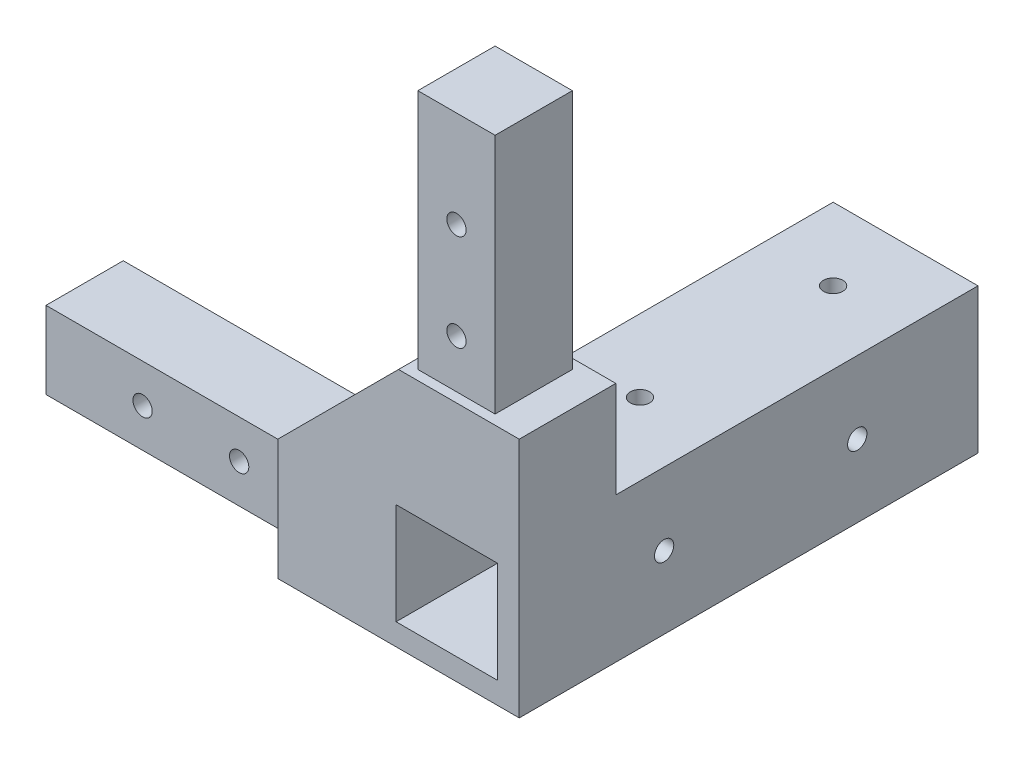
ISO-10303-21;
HEADER;
FILE_DESCRIPTION(('STEP AP214'),'2;1');
FILE_NAME('part.step','',(''),(''),'','','');
FILE_SCHEMA(('AUTOMOTIVE_DESIGN { 1 0 10303 214 1 1 1 1 }'));
ENDSEC;
DATA;
#1=APPLICATION_CONTEXT('core data for automotive mechanical design processes');
#2=APPLICATION_PROTOCOL_DEFINITION('international standard','automotive_design',2000,#1);
#3=PRODUCT_CONTEXT('',#1,'mechanical');
#4=PRODUCT('Part','Part','',(#3));
#5=PRODUCT_RELATED_PRODUCT_CATEGORY('part','',(#4));
#6=PRODUCT_DEFINITION_FORMATION('','',#4);
#7=PRODUCT_DEFINITION_CONTEXT('part definition',#1,'design');
#8=PRODUCT_DEFINITION('design','',#6,#7);
#9=PRODUCT_DEFINITION_SHAPE('','',#8);
#10=(LENGTH_UNIT() NAMED_UNIT(*) SI_UNIT(.MILLI.,.METRE.));
#11=(NAMED_UNIT(*) PLANE_ANGLE_UNIT() SI_UNIT($,.RADIAN.));
#12=(NAMED_UNIT(*) SI_UNIT($,.STERADIAN.) SOLID_ANGLE_UNIT());
#13=UNCERTAINTY_MEASURE_WITH_UNIT(LENGTH_MEASURE(1.E-05),#10,'distance_accuracy_value','');
#14=(GEOMETRIC_REPRESENTATION_CONTEXT(3) GLOBAL_UNCERTAINTY_ASSIGNED_CONTEXT((#13)) GLOBAL_UNIT_ASSIGNED_CONTEXT((#10,
#11,#12)) REPRESENTATION_CONTEXT('',''));
#15=CARTESIAN_POINT('',(0.,0.,0.));
#16=DIRECTION('',(0.,0.,1.));
#17=DIRECTION('',(1.,0.,0.));
#18=AXIS2_PLACEMENT_3D('',#15,#16,#17);
#19=CARTESIAN_POINT('',(50.,-50.,-100.));
#20=DIRECTION('',(1.,0.,0.));
#21=DIRECTION('',(0.,0.,-1.));
#22=AXIS2_PLACEMENT_3D('',#19,#20,#21);
#23=PLANE('',#22);
#24=DIRECTION('',(0.,0.,-1.));
#25=VECTOR('',#24,1.);
#26=CARTESIAN_POINT('',(50.,-20.,-30.));
#27=LINE('',#26,#25);
#28=CARTESIAN_POINT('',(50.,-20.,-25.));
#29=VERTEX_POINT('',#28);
#30=CARTESIAN_POINT('',(50.,-20.,-100.));
#31=VERTEX_POINT('',#30);
#32=EDGE_CURVE('E388',#29,#31,#27,.T.);
#33=ORIENTED_EDGE('',*,*,#32,.F.);
#34=DIRECTION('',(0.,1.,0.));
#35=VECTOR('',#34,1.);
#36=CARTESIAN_POINT('',(50.,-24.,-25.));
#37=LINE('',#36,#35);
#38=CARTESIAN_POINT('',(50.,0.,-25.));
#39=VERTEX_POINT('',#38);
#40=EDGE_CURVE('E198',#29,#39,#37,.T.);
#41=ORIENTED_EDGE('',*,*,#40,.T.);
#42=DIRECTION('',(0.,0.,-1.));
#43=VECTOR('',#42,1.);
#44=CARTESIAN_POINT('',(50.,0.,-5.));
#45=LINE('',#44,#43);
#46=CARTESIAN_POINT('',(50.,0.,-5.));
#47=VERTEX_POINT('',#46);
#48=EDGE_CURVE('E189',#47,#39,#45,.T.);
#49=ORIENTED_EDGE('',*,*,#48,.F.);
#50=DIRECTION('',(0.,1.,0.));
#51=VECTOR('',#50,1.);
#52=CARTESIAN_POINT('',(50.,-50.,-5.));
#53=LINE('',#52,#51);
#54=CARTESIAN_POINT('',(50.,-50.,-5.));
#55=VERTEX_POINT('',#54);
#56=EDGE_CURVE('E173',#55,#47,#53,.T.);
#57=ORIENTED_EDGE('',*,*,#56,.F.);
#58=DIRECTION('',(0.,0.,1.));
#59=VECTOR('',#58,1.);
#60=CARTESIAN_POINT('',(50.,-50.,-100.));
#61=LINE('',#60,#59);
#62=CARTESIAN_POINT('',(50.,-50.,-100.));
#63=VERTEX_POINT('',#62);
#64=EDGE_CURVE('E11',#63,#55,#61,.T.);
#65=ORIENTED_EDGE('',*,*,#64,.F.);
#66=DIRECTION('',(0.,1.,0.));
#67=VECTOR('',#66,1.);
#68=CARTESIAN_POINT('',(50.,-50.,-100.));
#69=LINE('',#68,#67);
#70=EDGE_CURVE('E42',#63,#31,#69,.T.);
#71=ORIENTED_EDGE('',*,*,#70,.T.);
#72=EDGE_LOOP('',(#33,#41,#49,#57,#65,#71));
#73=FACE_BOUND('',#72,.T.);
#74=CARTESIAN_POINT('',(50.,-35.,-35.));
#75=DIRECTION('',(1.,0.,0.));
#76=DIRECTION('',(0.,0.,-1.));
#77=AXIS2_PLACEMENT_3D('',#74,#75,#76);
#78=CIRCLE('',#77,2.);
#79=CARTESIAN_POINT('',(50.,-35.,-37.));
#80=VERTEX_POINT('',#79);
#81=EDGE_CURVE('E241',#80,#80,#78,.T.);
#82=ORIENTED_EDGE('',*,*,#81,.F.);
#83=EDGE_LOOP('',(#82));
#84=FACE_BOUND('',#83,.T.);
#85=CARTESIAN_POINT('',(50.,-35.,-75.));
#86=DIRECTION('',(1.,0.,0.));
#87=DIRECTION('',(0.,0.,-1.));
#88=AXIS2_PLACEMENT_3D('',#85,#86,#87);
#89=CIRCLE('',#88,2.);
#90=CARTESIAN_POINT('',(50.,-35.,-77.));
#91=VERTEX_POINT('',#90);
#92=EDGE_CURVE('E252',#91,#91,#89,.T.);
#93=ORIENTED_EDGE('',*,*,#92,.F.);
#94=EDGE_LOOP('',(#93));
#95=FACE_BOUND('',#94,.T.);
#96=ADVANCED_FACE('F33',(#73,#84,#95),#23,.T.);
#97=CARTESIAN_POINT('',(20.,-50.,-30.));
#98=DIRECTION('',(1.,0.,0.));
#99=DIRECTION('',(0.,0.,-1.));
#100=AXIS2_PLACEMENT_3D('',#97,#98,#99);
#101=PLANE('',#100);
#102=CARTESIAN_POINT('',(20.,-35.,-75.));
#103=DIRECTION('',(1.,0.,0.));
#104=DIRECTION('',(0.,0.,-1.));
#105=AXIS2_PLACEMENT_3D('',#102,#103,#104);
#106=CIRCLE('',#105,2.);
#107=CARTESIAN_POINT('',(20.,-35.,-77.));
#108=VERTEX_POINT('',#107);
#109=EDGE_CURVE('E253',#108,#108,#106,.T.);
#110=ORIENTED_EDGE('',*,*,#109,.T.);
#111=EDGE_LOOP('',(#110));
#112=FACE_BOUND('',#111,.T.);
#113=CARTESIAN_POINT('',(20.,-35.,-35.));
#114=DIRECTION('',(1.,0.,0.));
#115=DIRECTION('',(0.,0.,-1.));
#116=AXIS2_PLACEMENT_3D('',#113,#114,#115);
#117=CIRCLE('',#116,2.);
#118=CARTESIAN_POINT('',(20.,-35.,-37.));
#119=VERTEX_POINT('',#118);
#120=EDGE_CURVE('E244',#119,#119,#117,.T.);
#121=ORIENTED_EDGE('',*,*,#120,.T.);
#122=EDGE_LOOP('',(#121));
#123=FACE_BOUND('',#122,.T.);
#124=DIRECTION('',(0.,0.,-1.));
#125=VECTOR('',#124,1.);
#126=CARTESIAN_POINT('',(20.,-50.,-30.));
#127=LINE('',#126,#125);
#128=CARTESIAN_POINT('',(20.,-50.,-25.));
#129=VERTEX_POINT('',#128);
#130=CARTESIAN_POINT('',(20.,-50.,-100.));
#131=VERTEX_POINT('',#130);
#132=EDGE_CURVE('E389',#129,#131,#127,.T.);
#133=ORIENTED_EDGE('',*,*,#132,.F.);
#134=DIRECTION('',(0.,-1.,0.));
#135=VECTOR('',#134,1.);
#136=CARTESIAN_POINT('',(20.,-25.,-25.));
#137=LINE('',#136,#135);
#138=CARTESIAN_POINT('',(20.,-20.,-25.));
#139=VERTEX_POINT('',#138);
#140=EDGE_CURVE('E321',#139,#129,#137,.T.);
#141=ORIENTED_EDGE('',*,*,#140,.F.);
#142=DIRECTION('',(0.,0.,-1.));
#143=VECTOR('',#142,1.);
#144=CARTESIAN_POINT('',(20.,-20.,-30.));
#145=LINE('',#144,#143);
#146=CARTESIAN_POINT('',(20.,-20.,-100.));
#147=VERTEX_POINT('',#146);
#148=EDGE_CURVE('E392',#139,#147,#145,.T.);
#149=ORIENTED_EDGE('',*,*,#148,.T.);
#150=DIRECTION('',(0.,-1.,0.));
#151=VECTOR('',#150,1.);
#152=CARTESIAN_POINT('',(20.,-50.,-100.));
#153=LINE('',#152,#151);
#154=EDGE_CURVE('E385',#147,#131,#153,.T.);
#155=ORIENTED_EDGE('',*,*,#154,.T.);
#156=EDGE_LOOP('',(#133,#141,#149,#155));
#157=FACE_BOUND('',#156,.T.);
#158=ADVANCED_FACE('F420',(#112,#123,#157),#101,.F.);
#159=CARTESIAN_POINT('',(24.5,-24.5,0.));
#160=DIRECTION('',(0.,1.,0.));
#161=DIRECTION('',(0.,0.,1.));
#162=AXIS2_PLACEMENT_3D('',#159,#160,#161);
#163=PLANE('',#162);
#164=CARTESIAN_POINT('',(35.,-24.5,-85.));
#165=DIRECTION('',(0.,1.,0.));
#166=DIRECTION('',(0.,0.,1.));
#167=AXIS2_PLACEMENT_3D('',#164,#165,#166);
#168=CIRCLE('',#167,2.);
#169=CARTESIAN_POINT('',(35.,-24.5,-83.));
#170=VERTEX_POINT('',#169);
#171=EDGE_CURVE('E283',#170,#170,#168,.T.);
#172=ORIENTED_EDGE('',*,*,#171,.T.);
#173=EDGE_LOOP('',(#172));
#174=FACE_BOUND('',#173,.T.);
#175=CARTESIAN_POINT('',(35.,-24.5,-45.));
#176=DIRECTION('',(0.,1.,0.));
#177=DIRECTION('',(0.,0.,1.));
#178=AXIS2_PLACEMENT_3D('',#175,#176,#177);
#179=CIRCLE('',#178,2.);
#180=CARTESIAN_POINT('',(35.,-24.5,-43.));
#181=VERTEX_POINT('',#180);
#182=EDGE_CURVE('E271',#181,#181,#179,.T.);
#183=ORIENTED_EDGE('',*,*,#182,.T.);
#184=EDGE_LOOP('',(#183));
#185=FACE_BOUND('',#184,.T.);
#186=DIRECTION('',(1.,0.,0.));
#187=VECTOR('',#186,1.);
#188=CARTESIAN_POINT('',(24.5,-24.5,-5.));
#189=LINE('',#188,#187);
#190=CARTESIAN_POINT('',(24.5,-24.5,-4.99999999999999));
#191=VERTEX_POINT('',#190);
#192=CARTESIAN_POINT('',(45.5,-24.5,-5.));
#193=VERTEX_POINT('',#192);
#194=EDGE_CURVE('E50',#191,#193,#189,.T.);
#195=ORIENTED_EDGE('',*,*,#194,.F.);
#196=DIRECTION('',(0.,0.,-1.));
#197=VECTOR('',#196,1.);
#198=CARTESIAN_POINT('',(24.5,-24.5,0.));
#199=LINE('',#198,#197);
#200=CARTESIAN_POINT('',(24.5,-24.5,-100.));
#201=VERTEX_POINT('',#200);
#202=EDGE_CURVE('E378',#191,#201,#199,.T.);
#203=ORIENTED_EDGE('',*,*,#202,.T.);
#204=DIRECTION('',(1.,0.,0.));
#205=VECTOR('',#204,1.);
#206=CARTESIAN_POINT('',(24.5,-24.5,-100.));
#207=LINE('',#206,#205);
#208=CARTESIAN_POINT('',(45.5,-24.5,-100.));
#209=VERTEX_POINT('',#208);
#210=EDGE_CURVE('E371',#201,#209,#207,.T.);
#211=ORIENTED_EDGE('',*,*,#210,.T.);
#212=DIRECTION('',(0.,0.,-1.));
#213=VECTOR('',#212,1.);
#214=CARTESIAN_POINT('',(45.5,-24.5,0.));
#215=LINE('',#214,#213);
#216=EDGE_CURVE('E375',#193,#209,#215,.T.);
#217=ORIENTED_EDGE('',*,*,#216,.F.);
#218=EDGE_LOOP('',(#195,#203,#211,#217));
#219=FACE_BOUND('',#218,.T.);
#220=ADVANCED_FACE('F425',(#174,#185,#219),#163,.F.);
#221=CARTESIAN_POINT('',(24.5,-45.5,0.));
#222=DIRECTION('',(-1.,0.,0.));
#223=DIRECTION('',(0.,0.,1.));
#224=AXIS2_PLACEMENT_3D('',#221,#222,#223);
#225=PLANE('',#224);
#226=ORIENTED_EDGE('',*,*,#202,.F.);
#227=DIRECTION('',(0.,1.,0.));
#228=VECTOR('',#227,1.);
#229=CARTESIAN_POINT('',(24.5,-45.5,-5.));
#230=LINE('',#229,#228);
#231=CARTESIAN_POINT('',(24.5,-45.5,-5.));
#232=VERTEX_POINT('',#231);
#233=EDGE_CURVE('E216',#232,#191,#230,.T.);
#234=ORIENTED_EDGE('',*,*,#233,.F.);
#235=DIRECTION('',(0.,0.,-1.));
#236=VECTOR('',#235,1.);
#237=CARTESIAN_POINT('',(24.5,-45.5,0.));
#238=LINE('',#237,#236);
#239=CARTESIAN_POINT('',(24.5,-45.5,-100.));
#240=VERTEX_POINT('',#239);
#241=EDGE_CURVE('E380',#232,#240,#238,.T.);
#242=ORIENTED_EDGE('',*,*,#241,.T.);
#243=DIRECTION('',(0.,1.,0.));
#244=VECTOR('',#243,1.);
#245=CARTESIAN_POINT('',(24.5,-45.5,-100.));
#246=LINE('',#245,#244);
#247=EDGE_CURVE('E368',#240,#201,#246,.T.);
#248=ORIENTED_EDGE('',*,*,#247,.T.);
#249=EDGE_LOOP('',(#226,#234,#242,#248));
#250=FACE_BOUND('',#249,.T.);
#251=CARTESIAN_POINT('',(24.5,-35.,-75.));
#252=DIRECTION('',(-1.,0.,0.));
#253=DIRECTION('',(0.,0.,1.));
#254=AXIS2_PLACEMENT_3D('',#251,#252,#253);
#255=CIRCLE('',#254,2.);
#256=CARTESIAN_POINT('',(24.5,-35.,-73.));
#257=VERTEX_POINT('',#256);
#258=EDGE_CURVE('E259',#257,#257,#255,.T.);
#259=ORIENTED_EDGE('',*,*,#258,.T.);
#260=EDGE_LOOP('',(#259));
#261=FACE_BOUND('',#260,.T.);
#262=CARTESIAN_POINT('',(24.5,-35.,-35.));
#263=DIRECTION('',(-1.,0.,0.));
#264=DIRECTION('',(0.,0.,1.));
#265=AXIS2_PLACEMENT_3D('',#262,#263,#264);
#266=CIRCLE('',#265,2.);
#267=CARTESIAN_POINT('',(24.5,-35.,-33.));
#268=VERTEX_POINT('',#267);
#269=EDGE_CURVE('E249',#268,#268,#266,.T.);
#270=ORIENTED_EDGE('',*,*,#269,.T.);
#271=EDGE_LOOP('',(#270));
#272=FACE_BOUND('',#271,.T.);
#273=ADVANCED_FACE('F461',(#250,#261,#272),#225,.F.);
#274=CARTESIAN_POINT('',(24.5,-45.5,0.));
#275=DIRECTION('',(0.,-1.,0.));
#276=DIRECTION('',(0.,0.,-1.));
#277=AXIS2_PLACEMENT_3D('',#274,#275,#276);
#278=PLANE('',#277);
#279=CARTESIAN_POINT('',(35.,-45.5,-85.));
#280=DIRECTION('',(0.,-1.,0.));
#281=DIRECTION('',(0.,0.,-1.));
#282=AXIS2_PLACEMENT_3D('',#279,#280,#281);
#283=CIRCLE('',#282,2.);
#284=CARTESIAN_POINT('',(35.,-45.5,-87.));
#285=VERTEX_POINT('',#284);
#286=EDGE_CURVE('E278',#285,#285,#283,.T.);
#287=ORIENTED_EDGE('',*,*,#286,.T.);
#288=EDGE_LOOP('',(#287));
#289=FACE_BOUND('',#288,.T.);
#290=CARTESIAN_POINT('',(35.,-45.5,-45.));
#291=DIRECTION('',(0.,-1.,0.));
#292=DIRECTION('',(0.,0.,-1.));
#293=AXIS2_PLACEMENT_3D('',#290,#291,#292);
#294=CIRCLE('',#293,2.);
#295=CARTESIAN_POINT('',(35.,-45.5,-47.));
#296=VERTEX_POINT('',#295);
#297=EDGE_CURVE('E266',#296,#296,#294,.T.);
#298=ORIENTED_EDGE('',*,*,#297,.T.);
#299=EDGE_LOOP('',(#298));
#300=FACE_BOUND('',#299,.T.);
#301=DIRECTION('',(-1.,0.,0.));
#302=VECTOR('',#301,1.);
#303=CARTESIAN_POINT('',(24.5,-45.5,-5.));
#304=LINE('',#303,#302);
#305=CARTESIAN_POINT('',(45.5,-45.5,-5.));
#306=VERTEX_POINT('',#305);
#307=EDGE_CURVE('E214',#306,#232,#304,.T.);
#308=ORIENTED_EDGE('',*,*,#307,.F.);
#309=DIRECTION('',(0.,0.,-1.));
#310=VECTOR('',#309,1.);
#311=CARTESIAN_POINT('',(45.5,-45.5,0.));
#312=LINE('',#311,#310);
#313=CARTESIAN_POINT('',(45.5,-45.5,-100.));
#314=VERTEX_POINT('',#313);
#315=EDGE_CURVE('E374',#306,#314,#312,.T.);
#316=ORIENTED_EDGE('',*,*,#315,.T.);
#317=DIRECTION('',(-1.,0.,0.));
#318=VECTOR('',#317,1.);
#319=CARTESIAN_POINT('',(24.5,-45.5,-100.));
#320=LINE('',#319,#318);
#321=EDGE_CURVE('E365',#314,#240,#320,.T.);
#322=ORIENTED_EDGE('',*,*,#321,.T.);
#323=ORIENTED_EDGE('',*,*,#241,.F.);
#324=EDGE_LOOP('',(#308,#316,#322,#323));
#325=FACE_BOUND('',#324,.T.);
#326=ADVANCED_FACE('F458',(#289,#300,#325),#278,.F.);
#327=CARTESIAN_POINT('',(45.5,-45.5,0.));
#328=DIRECTION('',(1.,0.,0.));
#329=DIRECTION('',(0.,0.,-1.));
#330=AXIS2_PLACEMENT_3D('',#327,#328,#329);
#331=PLANE('',#330);
#332=CARTESIAN_POINT('',(45.5,-35.,-75.));
#333=DIRECTION('',(1.,0.,0.));
#334=DIRECTION('',(0.,0.,-1.));
#335=AXIS2_PLACEMENT_3D('',#332,#333,#334);
#336=CIRCLE('',#335,2.);
#337=CARTESIAN_POINT('',(45.5,-35.,-77.));
#338=VERTEX_POINT('',#337);
#339=EDGE_CURVE('E256',#338,#338,#336,.T.);
#340=ORIENTED_EDGE('',*,*,#339,.T.);
#341=EDGE_LOOP('',(#340));
#342=FACE_BOUND('',#341,.T.);
#343=CARTESIAN_POINT('',(45.5,-35.,-35.));
#344=DIRECTION('',(1.,0.,0.));
#345=DIRECTION('',(0.,0.,-1.));
#346=AXIS2_PLACEMENT_3D('',#343,#344,#345);
#347=CIRCLE('',#346,2.);
#348=CARTESIAN_POINT('',(45.5,-35.,-37.));
#349=VERTEX_POINT('',#348);
#350=EDGE_CURVE('E37',#349,#349,#347,.T.);
#351=ORIENTED_EDGE('',*,*,#350,.T.);
#352=EDGE_LOOP('',(#351));
#353=FACE_BOUND('',#352,.T.);
#354=DIRECTION('',(0.,-1.,0.));
#355=VECTOR('',#354,1.);
#356=CARTESIAN_POINT('',(45.5,-45.5,-5.));
#357=LINE('',#356,#355);
#358=EDGE_CURVE('E183',#193,#306,#357,.T.);
#359=ORIENTED_EDGE('',*,*,#358,.F.);
#360=ORIENTED_EDGE('',*,*,#216,.T.);
#361=DIRECTION('',(0.,-1.,0.));
#362=VECTOR('',#361,1.);
#363=CARTESIAN_POINT('',(45.5,-45.5,-100.));
#364=LINE('',#363,#362);
#365=EDGE_CURVE('E356',#209,#314,#364,.T.);
#366=ORIENTED_EDGE('',*,*,#365,.T.);
#367=ORIENTED_EDGE('',*,*,#315,.F.);
#368=EDGE_LOOP('',(#359,#360,#366,#367));
#369=FACE_BOUND('',#368,.T.);
#370=ADVANCED_FACE('F400',(#342,#353,#369),#331,.F.);
#371=CARTESIAN_POINT('',(20.,-20.,-30.));
#372=DIRECTION('',(0.,-1.,0.));
#373=DIRECTION('',(0.,0.,-1.));
#374=AXIS2_PLACEMENT_3D('',#371,#372,#373);
#375=PLANE('',#374);
#376=CARTESIAN_POINT('',(35.,-20.,-85.));
#377=DIRECTION('',(0.,1.,0.));
#378=DIRECTION('',(0.,0.,1.));
#379=AXIS2_PLACEMENT_3D('',#376,#377,#378);
#380=CIRCLE('',#379,2.);
#381=CARTESIAN_POINT('',(35.,-20.,-83.));
#382=VERTEX_POINT('',#381);
#383=EDGE_CURVE('E274',#382,#382,#380,.T.);
#384=ORIENTED_EDGE('',*,*,#383,.F.);
#385=EDGE_LOOP('',(#384));
#386=FACE_BOUND('',#385,.T.);
#387=CARTESIAN_POINT('',(35.,-20.,-45.));
#388=DIRECTION('',(0.,1.,0.));
#389=DIRECTION('',(0.,0.,1.));
#390=AXIS2_PLACEMENT_3D('',#387,#388,#389);
#391=CIRCLE('',#390,2.);
#392=CARTESIAN_POINT('',(35.,-20.,-43.));
#393=VERTEX_POINT('',#392);
#394=EDGE_CURVE('E262',#393,#393,#391,.T.);
#395=ORIENTED_EDGE('',*,*,#394,.F.);
#396=EDGE_LOOP('',(#395));
#397=FACE_BOUND('',#396,.T.);
#398=DIRECTION('',(-1.,0.,0.));
#399=VECTOR('',#398,1.);
#400=CARTESIAN_POINT('',(25.,-20.,-25.));
#401=LINE('',#400,#399);
#402=EDGE_CURVE('E318',#29,#139,#401,.T.);
#403=ORIENTED_EDGE('',*,*,#402,.F.);
#404=ORIENTED_EDGE('',*,*,#32,.T.);
#405=DIRECTION('',(-1.,0.,0.));
#406=VECTOR('',#405,1.);
#407=CARTESIAN_POINT('',(20.,-20.,-100.));
#408=LINE('',#407,#406);
#409=EDGE_CURVE('E377',#31,#147,#408,.T.);
#410=ORIENTED_EDGE('',*,*,#409,.T.);
#411=ORIENTED_EDGE('',*,*,#148,.F.);
#412=EDGE_LOOP('',(#403,#404,#410,#411));
#413=FACE_BOUND('',#412,.T.);
#414=ADVANCED_FACE('F434',(#386,#397,#413),#375,.F.);
#415=CARTESIAN_POINT('',(50.,-50.,-100.));
#416=DIRECTION('',(0.,-1.,0.));
#417=DIRECTION('',(1.,0.,0.));
#418=AXIS2_PLACEMENT_3D('',#415,#416,#417);
#419=PLANE('',#418);
#420=DIRECTION('',(1.,0.,0.));
#421=VECTOR('',#420,1.);
#422=CARTESIAN_POINT('',(20.,-50.,-5.));
#423=LINE('',#422,#421);
#424=CARTESIAN_POINT('',(0.,-50.,-4.99999999999999));
#425=VERTEX_POINT('',#424);
#426=EDGE_CURVE('E179',#425,#55,#423,.T.);
#427=ORIENTED_EDGE('',*,*,#426,.F.);
#428=DIRECTION('',(0.,0.,1.));
#429=VECTOR('',#428,1.);
#430=CARTESIAN_POINT('',(0.,-50.,-4.99999999999999));
#431=LINE('',#430,#429);
#432=CARTESIAN_POINT('',(0.,-50.,-25.));
#433=VERTEX_POINT('',#432);
#434=EDGE_CURVE('E200',#433,#425,#431,.T.);
#435=ORIENTED_EDGE('',*,*,#434,.F.);
#436=DIRECTION('',(-1.,0.,0.));
#437=VECTOR('',#436,1.);
#438=CARTESIAN_POINT('',(24.,-50.,-25.));
#439=LINE('',#438,#437);
#440=EDGE_CURVE('E205',#129,#433,#439,.T.);
#441=ORIENTED_EDGE('',*,*,#440,.F.);
#442=ORIENTED_EDGE('',*,*,#132,.T.);
#443=DIRECTION('',(1.,0.,0.));
#444=VECTOR('',#443,1.);
#445=CARTESIAN_POINT('',(50.,-50.,-100.));
#446=LINE('',#445,#444);
#447=EDGE_CURVE('E391',#131,#63,#446,.T.);
#448=ORIENTED_EDGE('',*,*,#447,.T.);
#449=ORIENTED_EDGE('',*,*,#64,.T.);
#450=EDGE_LOOP('',(#427,#435,#441,#442,#448,#449));
#451=FACE_BOUND('',#450,.T.);
#452=CARTESIAN_POINT('',(35.,-50.,-45.));
#453=DIRECTION('',(0.,1.,0.));
#454=DIRECTION('',(0.,0.,1.));
#455=AXIS2_PLACEMENT_3D('',#452,#453,#454);
#456=CIRCLE('',#455,2.);
#457=CARTESIAN_POINT('',(35.,-50.,-43.));
#458=VERTEX_POINT('',#457);
#459=EDGE_CURVE('E263',#458,#458,#456,.T.);
#460=ORIENTED_EDGE('',*,*,#459,.T.);
#461=EDGE_LOOP('',(#460));
#462=FACE_BOUND('',#461,.T.);
#463=CARTESIAN_POINT('',(35.,-50.,-85.));
#464=DIRECTION('',(0.,1.,0.));
#465=DIRECTION('',(0.,0.,1.));
#466=AXIS2_PLACEMENT_3D('',#463,#464,#465);
#467=CIRCLE('',#466,2.);
#468=CARTESIAN_POINT('',(35.,-50.,-83.));
#469=VERTEX_POINT('',#468);
#470=EDGE_CURVE('E275',#469,#469,#467,.T.);
#471=ORIENTED_EDGE('',*,*,#470,.T.);
#472=EDGE_LOOP('',(#471));
#473=FACE_BOUND('',#472,.T.);
#474=ADVANCED_FACE('F431',(#451,#462,#473),#419,.T.);
#475=CARTESIAN_POINT('',(0.,0.,0.));
#476=DIRECTION('',(-1.,0.,0.));
#477=DIRECTION('',(0.,0.,1.));
#478=AXIS2_PLACEMENT_3D('',#475,#476,#477);
#479=PLANE('',#478);
#480=DIRECTION('',(0.,1.,0.));
#481=VECTOR('',#480,1.);
#482=CARTESIAN_POINT('',(0.,-27.,-7.));
#483=LINE('',#482,#481);
#484=CARTESIAN_POINT('',(0.,-43.,-7.));
#485=VERTEX_POINT('',#484);
#486=CARTESIAN_POINT('',(0.,-27.,-7.));
#487=VERTEX_POINT('',#486);
#488=EDGE_CURVE('E330',#485,#487,#483,.T.);
#489=ORIENTED_EDGE('',*,*,#488,.F.);
#490=DIRECTION('',(0.,0.,1.));
#491=VECTOR('',#490,1.);
#492=CARTESIAN_POINT('',(0.,-43.,-23.));
#493=LINE('',#492,#491);
#494=CARTESIAN_POINT('',(0.,-43.,-23.));
#495=VERTEX_POINT('',#494);
#496=EDGE_CURVE('E340',#495,#485,#493,.T.);
#497=ORIENTED_EDGE('',*,*,#496,.F.);
#498=DIRECTION('',(0.,-1.,0.));
#499=VECTOR('',#498,1.);
#500=CARTESIAN_POINT('',(0.,-27.,-23.));
#501=LINE('',#500,#499);
#502=CARTESIAN_POINT('',(0.,-27.,-23.));
#503=VERTEX_POINT('',#502);
#504=EDGE_CURVE('E337',#503,#495,#501,.T.);
#505=ORIENTED_EDGE('',*,*,#504,.F.);
#506=DIRECTION('',(0.,0.,-1.));
#507=VECTOR('',#506,1.);
#508=CARTESIAN_POINT('',(0.,-27.,-23.));
#509=LINE('',#508,#507);
#510=EDGE_CURVE('E333',#487,#503,#509,.T.);
#511=ORIENTED_EDGE('',*,*,#510,.F.);
#512=EDGE_LOOP('',(#489,#497,#505,#511));
#513=FACE_BOUND('',#512,.T.);
#514=DIRECTION('',(0.,1.,0.));
#515=VECTOR('',#514,1.);
#516=CARTESIAN_POINT('',(0.,-25.,-4.99999999999999));
#517=LINE('',#516,#515);
#518=CARTESIAN_POINT('',(0.,-25.,-4.99999999999999));
#519=VERTEX_POINT('',#518);
#520=EDGE_CURVE('E320',#425,#519,#517,.T.);
#521=ORIENTED_EDGE('',*,*,#520,.T.);
#522=DIRECTION('',(0.,0.,-1.));
#523=VECTOR('',#522,1.);
#524=CARTESIAN_POINT('',(0.,-25.,-25.));
#525=LINE('',#524,#523);
#526=CARTESIAN_POINT('',(0.,-25.,-25.));
#527=VERTEX_POINT('',#526);
#528=EDGE_CURVE('E326',#519,#527,#525,.T.);
#529=ORIENTED_EDGE('',*,*,#528,.T.);
#530=DIRECTION('',(0.,-1.,0.));
#531=VECTOR('',#530,1.);
#532=CARTESIAN_POINT('',(0.,-25.,-25.));
#533=LINE('',#532,#531);
#534=EDGE_CURVE('E324',#527,#433,#533,.T.);
#535=ORIENTED_EDGE('',*,*,#534,.T.);
#536=ORIENTED_EDGE('',*,*,#434,.T.);
#537=EDGE_LOOP('',(#521,#529,#535,#536));
#538=FACE_BOUND('',#537,.T.);
#539=ADVANCED_FACE('F433',(#513,#538),#479,.T.);
#540=CARTESIAN_POINT('',(0.,-27.,-7.));
#541=DIRECTION('',(0.,0.,1.));
#542=DIRECTION('',(0.,-1.,0.));
#543=AXIS2_PLACEMENT_3D('',#540,#541,#542);
#544=PLANE('',#543);
#545=CARTESIAN_POINT('',(-10.,-35.,-7.));
#546=DIRECTION('',(0.,0.,-1.));
#547=DIRECTION('',(-1.,0.,0.));
#548=AXIS2_PLACEMENT_3D('',#545,#546,#547);
#549=CIRCLE('',#548,2.);
#550=CARTESIAN_POINT('',(-12.,-35.,-7.));
#551=VERTEX_POINT('',#550);
#552=EDGE_CURVE('E220',#551,#551,#549,.T.);
#553=ORIENTED_EDGE('',*,*,#552,.T.);
#554=EDGE_LOOP('',(#553));
#555=FACE_BOUND('',#554,.T.);
#556=CARTESIAN_POINT('',(-30.,-35.,-7.));
#557=DIRECTION('',(0.,0.,-1.));
#558=DIRECTION('',(-1.,0.,0.));
#559=AXIS2_PLACEMENT_3D('',#556,#557,#558);
#560=CIRCLE('',#559,2.);
#561=CARTESIAN_POINT('',(-32.,-35.,-7.));
#562=VERTEX_POINT('',#561);
#563=EDGE_CURVE('E226',#562,#562,#560,.T.);
#564=ORIENTED_EDGE('',*,*,#563,.T.);
#565=EDGE_LOOP('',(#564));
#566=FACE_BOUND('',#565,.T.);
#567=DIRECTION('',(0.,1.,0.));
#568=VECTOR('',#567,1.);
#569=CARTESIAN_POINT('',(-50.,-27.,-7.));
#570=LINE('',#569,#568);
#571=CARTESIAN_POINT('',(-50.,-43.,-7.));
#572=VERTEX_POINT('',#571);
#573=CARTESIAN_POINT('',(-50.,-27.,-7.));
#574=VERTEX_POINT('',#573);
#575=EDGE_CURVE('E323',#572,#574,#570,.T.);
#576=ORIENTED_EDGE('',*,*,#575,.F.);
#577=DIRECTION('',(-1.,0.,0.));
#578=VECTOR('',#577,1.);
#579=CARTESIAN_POINT('',(0.,-43.,-7.));
#580=LINE('',#579,#578);
#581=EDGE_CURVE('E354',#485,#572,#580,.T.);
#582=ORIENTED_EDGE('',*,*,#581,.F.);
#583=ORIENTED_EDGE('',*,*,#488,.T.);
#584=DIRECTION('',(-1.,0.,0.));
#585=VECTOR('',#584,1.);
#586=CARTESIAN_POINT('',(0.,-27.,-7.));
#587=LINE('',#586,#585);
#588=EDGE_CURVE('E343',#487,#574,#587,.T.);
#589=ORIENTED_EDGE('',*,*,#588,.T.);
#590=EDGE_LOOP('',(#576,#582,#583,#589));
#591=FACE_BOUND('',#590,.T.);
#592=ADVANCED_FACE('F440',(#555,#566,#591),#544,.T.);
#593=CARTESIAN_POINT('',(0.,-43.,-23.));
#594=DIRECTION('',(0.,-1.,0.));
#595=DIRECTION('',(0.,0.,-1.));
#596=AXIS2_PLACEMENT_3D('',#593,#594,#595);
#597=PLANE('',#596);
#598=DIRECTION('',(0.,0.,1.));
#599=VECTOR('',#598,1.);
#600=CARTESIAN_POINT('',(-50.,-43.,-23.));
#601=LINE('',#600,#599);
#602=CARTESIAN_POINT('',(-50.,-43.,-23.));
#603=VERTEX_POINT('',#602);
#604=EDGE_CURVE('E334',#603,#572,#601,.T.);
#605=ORIENTED_EDGE('',*,*,#604,.F.);
#606=DIRECTION('',(-1.,0.,0.));
#607=VECTOR('',#606,1.);
#608=CARTESIAN_POINT('',(0.,-43.,-23.));
#609=LINE('',#608,#607);
#610=EDGE_CURVE('E357',#495,#603,#609,.T.);
#611=ORIENTED_EDGE('',*,*,#610,.F.);
#612=ORIENTED_EDGE('',*,*,#496,.T.);
#613=ORIENTED_EDGE('',*,*,#581,.T.);
#614=EDGE_LOOP('',(#605,#611,#612,#613));
#615=FACE_BOUND('',#614,.T.);
#616=ADVANCED_FACE('F511',(#615),#597,.T.);
#617=CARTESIAN_POINT('',(0.,-27.,-23.));
#618=DIRECTION('',(0.,0.,-1.));
#619=DIRECTION('',(-1.,0.,0.));
#620=AXIS2_PLACEMENT_3D('',#617,#618,#619);
#621=PLANE('',#620);
#622=CARTESIAN_POINT('',(-10.,-35.,-23.));
#623=DIRECTION('',(0.,0.,-1.));
#624=DIRECTION('',(-1.,0.,0.));
#625=AXIS2_PLACEMENT_3D('',#622,#623,#624);
#626=CIRCLE('',#625,2.);
#627=CARTESIAN_POINT('',(-12.,-35.,-23.));
#628=VERTEX_POINT('',#627);
#629=EDGE_CURVE('E219',#628,#628,#626,.T.);
#630=ORIENTED_EDGE('',*,*,#629,.F.);
#631=EDGE_LOOP('',(#630));
#632=FACE_BOUND('',#631,.T.);
#633=CARTESIAN_POINT('',(-30.,-35.,-23.));
#634=DIRECTION('',(0.,0.,-1.));
#635=DIRECTION('',(-1.,0.,0.));
#636=AXIS2_PLACEMENT_3D('',#633,#634,#635);
#637=CIRCLE('',#636,2.);
#638=CARTESIAN_POINT('',(-32.,-35.,-23.));
#639=VERTEX_POINT('',#638);
#640=EDGE_CURVE('E223',#639,#639,#637,.T.);
#641=ORIENTED_EDGE('',*,*,#640,.F.);
#642=EDGE_LOOP('',(#641));
#643=FACE_BOUND('',#642,.T.);
#644=DIRECTION('',(0.,-1.,0.));
#645=VECTOR('',#644,1.);
#646=CARTESIAN_POINT('',(-50.,-27.,-23.));
#647=LINE('',#646,#645);
#648=CARTESIAN_POINT('',(-50.,-27.,-23.));
#649=VERTEX_POINT('',#648);
#650=EDGE_CURVE('E349',#649,#603,#647,.T.);
#651=ORIENTED_EDGE('',*,*,#650,.F.);
#652=DIRECTION('',(-1.,0.,0.));
#653=VECTOR('',#652,1.);
#654=CARTESIAN_POINT('',(0.,-27.,-23.));
#655=LINE('',#654,#653);
#656=EDGE_CURVE('E359',#503,#649,#655,.T.);
#657=ORIENTED_EDGE('',*,*,#656,.F.);
#658=ORIENTED_EDGE('',*,*,#504,.T.);
#659=ORIENTED_EDGE('',*,*,#610,.T.);
#660=EDGE_LOOP('',(#651,#657,#658,#659));
#661=FACE_BOUND('',#660,.T.);
#662=ADVANCED_FACE('F514',(#632,#643,#661),#621,.T.);
#663=CARTESIAN_POINT('',(0.,-27.,-23.));
#664=DIRECTION('',(0.,1.,0.));
#665=DIRECTION('',(0.,0.,1.));
#666=AXIS2_PLACEMENT_3D('',#663,#664,#665);
#667=PLANE('',#666);
#668=DIRECTION('',(0.,0.,-1.));
#669=VECTOR('',#668,1.);
#670=CARTESIAN_POINT('',(-50.,-27.,-23.));
#671=LINE('',#670,#669);
#672=EDGE_CURVE('E346',#574,#649,#671,.T.);
#673=ORIENTED_EDGE('',*,*,#672,.F.);
#674=ORIENTED_EDGE('',*,*,#588,.F.);
#675=ORIENTED_EDGE('',*,*,#510,.T.);
#676=ORIENTED_EDGE('',*,*,#656,.T.);
#677=EDGE_LOOP('',(#673,#674,#675,#676));
#678=FACE_BOUND('',#677,.T.);
#679=ADVANCED_FACE('F518',(#678),#667,.T.);
#680=CARTESIAN_POINT('',(-50.,-50.,-100.));
#681=DIRECTION('',(-1.,0.,0.));
#682=DIRECTION('',(0.,0.,1.));
#683=AXIS2_PLACEMENT_3D('',#680,#681,#682);
#684=PLANE('',#683);
#685=ORIENTED_EDGE('',*,*,#604,.T.);
#686=ORIENTED_EDGE('',*,*,#575,.T.);
#687=ORIENTED_EDGE('',*,*,#672,.T.);
#688=ORIENTED_EDGE('',*,*,#650,.T.);
#689=EDGE_LOOP('',(#685,#686,#687,#688));
#690=FACE_BOUND('',#689,.T.);
#691=ADVANCED_FACE('F35',(#690),#684,.T.);
#692=CARTESIAN_POINT('',(20.,-25.,-4.99999999999999));
#693=DIRECTION('',(0.,0.,1.));
#694=DIRECTION('',(1.,0.,0.));
#695=AXIS2_PLACEMENT_3D('',#692,#693,#694);
#696=PLANE('',#695);
#697=ORIENTED_EDGE('',*,*,#56,.T.);
#698=DIRECTION('',(1.,0.,0.));
#699=VECTOR('',#698,1.);
#700=CARTESIAN_POINT('',(25.,0.,-5.));
#701=LINE('',#700,#699);
#702=CARTESIAN_POINT('',(25.,0.,-5.));
#703=VERTEX_POINT('',#702);
#704=EDGE_CURVE('E177',#703,#47,#701,.T.);
#705=ORIENTED_EDGE('',*,*,#704,.F.);
#706=DIRECTION('',(-0.707106781186547,-0.707106781186548,0.));
#707=VECTOR('',#706,1.);
#708=CARTESIAN_POINT('',(25.,0.,-4.99999999999999));
#709=LINE('',#708,#707);
#710=EDGE_CURVE('E208',#703,#519,#709,.T.);
#711=ORIENTED_EDGE('',*,*,#710,.T.);
#712=ORIENTED_EDGE('',*,*,#520,.F.);
#713=ORIENTED_EDGE('',*,*,#426,.T.);
#714=EDGE_LOOP('',(#697,#705,#711,#712,#713));
#715=FACE_BOUND('',#714,.T.);
#716=ORIENTED_EDGE('',*,*,#233,.T.);
#717=ORIENTED_EDGE('',*,*,#194,.T.);
#718=ORIENTED_EDGE('',*,*,#358,.T.);
#719=ORIENTED_EDGE('',*,*,#307,.T.);
#720=EDGE_LOOP('',(#716,#717,#718,#719));
#721=FACE_BOUND('',#720,.T.);
#722=ADVANCED_FACE('F175',(#715,#721),#696,.T.);
#723=CARTESIAN_POINT('',(20.,-25.,-25.));
#724=DIRECTION('',(0.,0.,-1.));
#725=DIRECTION('',(-1.,0.,0.));
#726=AXIS2_PLACEMENT_3D('',#723,#724,#725);
#727=PLANE('',#726);
#728=DIRECTION('',(-0.707106781186547,-0.707106781186548,0.));
#729=VECTOR('',#728,1.);
#730=CARTESIAN_POINT('',(25.,0.,-25.));
#731=LINE('',#730,#729);
#732=CARTESIAN_POINT('',(25.,0.,-25.));
#733=VERTEX_POINT('',#732);
#734=EDGE_CURVE('E209',#733,#527,#731,.T.);
#735=ORIENTED_EDGE('',*,*,#734,.F.);
#736=DIRECTION('',(-1.,0.,0.));
#737=VECTOR('',#736,1.);
#738=CARTESIAN_POINT('',(25.,0.,-25.));
#739=LINE('',#738,#737);
#740=EDGE_CURVE('E192',#39,#733,#739,.T.);
#741=ORIENTED_EDGE('',*,*,#740,.F.);
#742=ORIENTED_EDGE('',*,*,#40,.F.);
#743=ORIENTED_EDGE('',*,*,#402,.T.);
#744=ORIENTED_EDGE('',*,*,#140,.T.);
#745=ORIENTED_EDGE('',*,*,#440,.T.);
#746=ORIENTED_EDGE('',*,*,#534,.F.);
#747=EDGE_LOOP('',(#735,#741,#742,#743,#744,#745,#746));
#748=FACE_BOUND('',#747,.T.);
#749=ADVANCED_FACE('F494',(#748),#727,.T.);
#750=CARTESIAN_POINT('',(0.,0.,-100.));
#751=DIRECTION('',(0.,0.,1.));
#752=DIRECTION('',(1.,0.,0.));
#753=AXIS2_PLACEMENT_3D('',#750,#751,#752);
#754=PLANE('',#753);
#755=ORIENTED_EDGE('',*,*,#321,.F.);
#756=ORIENTED_EDGE('',*,*,#365,.F.);
#757=ORIENTED_EDGE('',*,*,#210,.F.);
#758=ORIENTED_EDGE('',*,*,#247,.F.);
#759=EDGE_LOOP('',(#755,#756,#757,#758));
#760=FACE_BOUND('',#759,.T.);
#761=ORIENTED_EDGE('',*,*,#447,.F.);
#762=ORIENTED_EDGE('',*,*,#154,.F.);
#763=ORIENTED_EDGE('',*,*,#409,.F.);
#764=ORIENTED_EDGE('',*,*,#70,.F.);
#765=EDGE_LOOP('',(#761,#762,#763,#764));
#766=FACE_BOUND('',#765,.T.);
#767=ADVANCED_FACE('F476',(#760,#766),#754,.F.);
#768=CARTESIAN_POINT('',(0.,0.,0.));
#769=DIRECTION('',(0.,1.,0.));
#770=DIRECTION('',(0.,0.,1.));
#771=AXIS2_PLACEMENT_3D('',#768,#769,#770);
#772=PLANE('',#771);
#773=DIRECTION('',(-1.,0.,0.));
#774=VECTOR('',#773,1.);
#775=CARTESIAN_POINT('',(27.,0.,-23.));
#776=LINE('',#775,#774);
#777=CARTESIAN_POINT('',(43.,0.,-23.));
#778=VERTEX_POINT('',#777);
#779=CARTESIAN_POINT('',(27.,0.,-23.));
#780=VERTEX_POINT('',#779);
#781=EDGE_CURVE('E290',#778,#780,#776,.T.);
#782=ORIENTED_EDGE('',*,*,#781,.F.);
#783=DIRECTION('',(0.,0.,-1.));
#784=VECTOR('',#783,1.);
#785=CARTESIAN_POINT('',(43.,0.,-23.));
#786=LINE('',#785,#784);
#787=CARTESIAN_POINT('',(43.,0.,-7.));
#788=VERTEX_POINT('',#787);
#789=EDGE_CURVE('E287',#788,#778,#786,.T.);
#790=ORIENTED_EDGE('',*,*,#789,.F.);
#791=DIRECTION('',(1.,0.,0.));
#792=VECTOR('',#791,1.);
#793=CARTESIAN_POINT('',(27.,0.,-7.));
#794=LINE('',#793,#792);
#795=CARTESIAN_POINT('',(27.,0.,-7.));
#796=VERTEX_POINT('',#795);
#797=EDGE_CURVE('E297',#796,#788,#794,.T.);
#798=ORIENTED_EDGE('',*,*,#797,.F.);
#799=DIRECTION('',(0.,0.,1.));
#800=VECTOR('',#799,1.);
#801=CARTESIAN_POINT('',(27.,0.,-23.));
#802=LINE('',#801,#800);
#803=EDGE_CURVE('E294',#780,#796,#802,.T.);
#804=ORIENTED_EDGE('',*,*,#803,.F.);
#805=EDGE_LOOP('',(#782,#790,#798,#804));
#806=FACE_BOUND('',#805,.T.);
#807=ORIENTED_EDGE('',*,*,#740,.T.);
#808=DIRECTION('',(0.,0.,1.));
#809=VECTOR('',#808,1.);
#810=CARTESIAN_POINT('',(25.,0.,-25.));
#811=LINE('',#810,#809);
#812=EDGE_CURVE('E191',#733,#703,#811,.T.);
#813=ORIENTED_EDGE('',*,*,#812,.T.);
#814=ORIENTED_EDGE('',*,*,#704,.T.);
#815=ORIENTED_EDGE('',*,*,#48,.T.);
#816=EDGE_LOOP('',(#807,#813,#814,#815));
#817=FACE_BOUND('',#816,.T.);
#818=ADVANCED_FACE('F188',(#806,#817),#772,.T.);
#819=CARTESIAN_POINT('',(43.,0.,-23.));
#820=DIRECTION('',(1.,0.,0.));
#821=DIRECTION('',(0.,1.,0.));
#822=AXIS2_PLACEMENT_3D('',#819,#820,#821);
#823=PLANE('',#822);
#824=DIRECTION('',(0.,0.,-1.));
#825=VECTOR('',#824,1.);
#826=CARTESIAN_POINT('',(43.,50.,-23.));
#827=LINE('',#826,#825);
#828=CARTESIAN_POINT('',(43.,50.,-7.));
#829=VERTEX_POINT('',#828);
#830=CARTESIAN_POINT('',(43.,50.,-23.));
#831=VERTEX_POINT('',#830);
#832=EDGE_CURVE('E286',#829,#831,#827,.T.);
#833=ORIENTED_EDGE('',*,*,#832,.F.);
#834=DIRECTION('',(0.,1.,0.));
#835=VECTOR('',#834,1.);
#836=CARTESIAN_POINT('',(43.,0.,-7.));
#837=LINE('',#836,#835);
#838=EDGE_CURVE('E309',#788,#829,#837,.T.);
#839=ORIENTED_EDGE('',*,*,#838,.F.);
#840=ORIENTED_EDGE('',*,*,#789,.T.);
#841=DIRECTION('',(0.,1.,0.));
#842=VECTOR('',#841,1.);
#843=CARTESIAN_POINT('',(43.,0.,-23.));
#844=LINE('',#843,#842);
#845=EDGE_CURVE('E300',#778,#831,#844,.T.);
#846=ORIENTED_EDGE('',*,*,#845,.T.);
#847=EDGE_LOOP('',(#833,#839,#840,#846));
#848=FACE_BOUND('',#847,.T.);
#849=ADVANCED_FACE('F499',(#848),#823,.T.);
#850=CARTESIAN_POINT('',(27.,0.,-7.));
#851=DIRECTION('',(0.,0.,1.));
#852=DIRECTION('',(1.,0.,0.));
#853=AXIS2_PLACEMENT_3D('',#850,#851,#852);
#854=PLANE('',#853);
#855=CARTESIAN_POINT('',(35.,10.,-7.00000000000001));
#856=DIRECTION('',(0.,0.,-1.));
#857=DIRECTION('',(-1.,0.,0.));
#858=AXIS2_PLACEMENT_3D('',#855,#856,#857);
#859=CIRCLE('',#858,2.);
#860=CARTESIAN_POINT('',(33.,10.,-7.00000000000001));
#861=VERTEX_POINT('',#860);
#862=EDGE_CURVE('E232',#861,#861,#859,.T.);
#863=ORIENTED_EDGE('',*,*,#862,.T.);
#864=EDGE_LOOP('',(#863));
#865=FACE_BOUND('',#864,.T.);
#866=CARTESIAN_POINT('',(35.,30.,-7.00000000000001));
#867=DIRECTION('',(0.,0.,-1.));
#868=DIRECTION('',(-1.,0.,0.));
#869=AXIS2_PLACEMENT_3D('',#866,#867,#868);
#870=CIRCLE('',#869,2.);
#871=CARTESIAN_POINT('',(33.,30.,-7.00000000000001));
#872=VERTEX_POINT('',#871);
#873=EDGE_CURVE('E238',#872,#872,#870,.T.);
#874=ORIENTED_EDGE('',*,*,#873,.T.);
#875=EDGE_LOOP('',(#874));
#876=FACE_BOUND('',#875,.T.);
#877=DIRECTION('',(1.,0.,0.));
#878=VECTOR('',#877,1.);
#879=CARTESIAN_POINT('',(27.,50.,-7.));
#880=LINE('',#879,#878);
#881=CARTESIAN_POINT('',(27.,50.,-7.));
#882=VERTEX_POINT('',#881);
#883=EDGE_CURVE('E291',#882,#829,#880,.T.);
#884=ORIENTED_EDGE('',*,*,#883,.F.);
#885=DIRECTION('',(0.,1.,0.));
#886=VECTOR('',#885,1.);
#887=CARTESIAN_POINT('',(27.,0.,-7.));
#888=LINE('',#887,#886);
#889=EDGE_CURVE('E311',#796,#882,#888,.T.);
#890=ORIENTED_EDGE('',*,*,#889,.F.);
#891=ORIENTED_EDGE('',*,*,#797,.T.);
#892=ORIENTED_EDGE('',*,*,#838,.T.);
#893=EDGE_LOOP('',(#884,#890,#891,#892));
#894=FACE_BOUND('',#893,.T.);
#895=ADVANCED_FACE('F653',(#865,#876,#894),#854,.T.);
#896=CARTESIAN_POINT('',(27.,0.,-23.));
#897=DIRECTION('',(-1.,0.,0.));
#898=DIRECTION('',(0.,-1.,0.));
#899=AXIS2_PLACEMENT_3D('',#896,#897,#898);
#900=PLANE('',#899);
#901=DIRECTION('',(0.,0.,1.));
#902=VECTOR('',#901,1.);
#903=CARTESIAN_POINT('',(27.,50.,-23.));
#904=LINE('',#903,#902);
#905=CARTESIAN_POINT('',(27.,50.,-23.));
#906=VERTEX_POINT('',#905);
#907=EDGE_CURVE('E58',#906,#882,#904,.T.);
#908=ORIENTED_EDGE('',*,*,#907,.F.);
#909=DIRECTION('',(0.,1.,0.));
#910=VECTOR('',#909,1.);
#911=CARTESIAN_POINT('',(27.,0.,-23.));
#912=LINE('',#911,#910);
#913=EDGE_CURVE('E313',#780,#906,#912,.T.);
#914=ORIENTED_EDGE('',*,*,#913,.F.);
#915=ORIENTED_EDGE('',*,*,#803,.T.);
#916=ORIENTED_EDGE('',*,*,#889,.T.);
#917=EDGE_LOOP('',(#908,#914,#915,#916));
#918=FACE_BOUND('',#917,.T.);
#919=ADVANCED_FACE('F648',(#918),#900,.T.);
#920=CARTESIAN_POINT('',(27.,0.,-23.));
#921=DIRECTION('',(0.,0.,-1.));
#922=DIRECTION('',(-1.,0.,0.));
#923=AXIS2_PLACEMENT_3D('',#920,#921,#922);
#924=PLANE('',#923);
#925=CARTESIAN_POINT('',(35.,10.,-23.));
#926=DIRECTION('',(0.,0.,-1.));
#927=DIRECTION('',(-1.,0.,0.));
#928=AXIS2_PLACEMENT_3D('',#925,#926,#927);
#929=CIRCLE('',#928,2.);
#930=CARTESIAN_POINT('',(33.,10.,-23.));
#931=VERTEX_POINT('',#930);
#932=EDGE_CURVE('E229',#931,#931,#929,.T.);
#933=ORIENTED_EDGE('',*,*,#932,.F.);
#934=EDGE_LOOP('',(#933));
#935=FACE_BOUND('',#934,.T.);
#936=CARTESIAN_POINT('',(35.,30.,-23.));
#937=DIRECTION('',(0.,0.,-1.));
#938=DIRECTION('',(-1.,0.,0.));
#939=AXIS2_PLACEMENT_3D('',#936,#937,#938);
#940=CIRCLE('',#939,2.);
#941=CARTESIAN_POINT('',(33.,30.,-23.));
#942=VERTEX_POINT('',#941);
#943=EDGE_CURVE('E235',#942,#942,#940,.T.);
#944=ORIENTED_EDGE('',*,*,#943,.F.);
#945=EDGE_LOOP('',(#944));
#946=FACE_BOUND('',#945,.T.);
#947=DIRECTION('',(-1.,0.,0.));
#948=VECTOR('',#947,1.);
#949=CARTESIAN_POINT('',(27.,50.,-23.));
#950=LINE('',#949,#948);
#951=EDGE_CURVE('E303',#831,#906,#950,.T.);
#952=ORIENTED_EDGE('',*,*,#951,.F.);
#953=ORIENTED_EDGE('',*,*,#845,.F.);
#954=ORIENTED_EDGE('',*,*,#781,.T.);
#955=ORIENTED_EDGE('',*,*,#913,.T.);
#956=EDGE_LOOP('',(#952,#953,#954,#955));
#957=FACE_BOUND('',#956,.T.);
#958=ADVANCED_FACE('F640',(#935,#946,#957),#924,.T.);
#959=CARTESIAN_POINT('',(50.,50.,-100.));
#960=DIRECTION('',(0.,1.,0.));
#961=DIRECTION('',(-1.,0.,0.));
#962=AXIS2_PLACEMENT_3D('',#959,#960,#961);
#963=PLANE('',#962);
#964=ORIENTED_EDGE('',*,*,#883,.T.);
#965=ORIENTED_EDGE('',*,*,#832,.T.);
#966=ORIENTED_EDGE('',*,*,#951,.T.);
#967=ORIENTED_EDGE('',*,*,#907,.T.);
#968=EDGE_LOOP('',(#964,#965,#966,#967));
#969=FACE_BOUND('',#968,.T.);
#970=ADVANCED_FACE('F429',(#969),#963,.T.);
#971=CARTESIAN_POINT('',(35.,-50.,-85.));
#972=DIRECTION('',(0.,1.,0.));
#973=DIRECTION('',(0.,0.,1.));
#974=AXIS2_PLACEMENT_3D('',#971,#972,#973);
#975=CYLINDRICAL_SURFACE('',#974,2.);
#976=ORIENTED_EDGE('',*,*,#470,.F.);
#977=EDGE_LOOP('',(#976));
#978=FACE_BOUND('',#977,.T.);
#979=ORIENTED_EDGE('',*,*,#286,.F.);
#980=EDGE_LOOP('',(#979));
#981=FACE_BOUND('',#980,.T.);
#982=ADVANCED_FACE('F451',(#978,#981),#975,.F.);
#983=ORIENTED_EDGE('',*,*,#383,.T.);
#984=EDGE_LOOP('',(#983));
#985=FACE_BOUND('',#984,.T.);
#986=ORIENTED_EDGE('',*,*,#171,.F.);
#987=EDGE_LOOP('',(#986));
#988=FACE_BOUND('',#987,.T.);
#989=ADVANCED_FACE('F454',(#985,#988),#975,.F.);
#990=CARTESIAN_POINT('',(35.,-50.,-45.));
#991=DIRECTION('',(0.,1.,0.));
#992=DIRECTION('',(0.,0.,1.));
#993=AXIS2_PLACEMENT_3D('',#990,#991,#992);
#994=CYLINDRICAL_SURFACE('',#993,2.);
#995=ORIENTED_EDGE('',*,*,#459,.F.);
#996=EDGE_LOOP('',(#995));
#997=FACE_BOUND('',#996,.T.);
#998=ORIENTED_EDGE('',*,*,#297,.F.);
#999=EDGE_LOOP('',(#998));
#1000=FACE_BOUND('',#999,.T.);
#1001=ADVANCED_FACE('F415',(#997,#1000),#994,.F.);
#1002=ORIENTED_EDGE('',*,*,#394,.T.);
#1003=EDGE_LOOP('',(#1002));
#1004=FACE_BOUND('',#1003,.T.);
#1005=ORIENTED_EDGE('',*,*,#182,.F.);
#1006=EDGE_LOOP('',(#1005));
#1007=FACE_BOUND('',#1006,.T.);
#1008=ADVANCED_FACE('F406',(#1004,#1007),#994,.F.);
#1009=CARTESIAN_POINT('',(20.,-35.,-75.));
#1010=DIRECTION('',(1.,0.,0.));
#1011=DIRECTION('',(0.,0.,-1.));
#1012=AXIS2_PLACEMENT_3D('',#1009,#1010,#1011);
#1013=CYLINDRICAL_SURFACE('',#1012,2.);
#1014=ORIENTED_EDGE('',*,*,#92,.T.);
#1015=EDGE_LOOP('',(#1014));
#1016=FACE_BOUND('',#1015,.T.);
#1017=ORIENTED_EDGE('',*,*,#339,.F.);
#1018=EDGE_LOOP('',(#1017));
#1019=FACE_BOUND('',#1018,.T.);
#1020=ADVANCED_FACE('F403',(#1016,#1019),#1013,.F.);
#1021=ORIENTED_EDGE('',*,*,#109,.F.);
#1022=EDGE_LOOP('',(#1021));
#1023=FACE_BOUND('',#1022,.T.);
#1024=ORIENTED_EDGE('',*,*,#258,.F.);
#1025=EDGE_LOOP('',(#1024));
#1026=FACE_BOUND('',#1025,.T.);
#1027=ADVANCED_FACE('F405',(#1023,#1026),#1013,.F.);
#1028=CARTESIAN_POINT('',(20.,-35.,-35.));
#1029=DIRECTION('',(1.,0.,0.));
#1030=DIRECTION('',(0.,0.,-1.));
#1031=AXIS2_PLACEMENT_3D('',#1028,#1029,#1030);
#1032=CYLINDRICAL_SURFACE('',#1031,2.);
#1033=ORIENTED_EDGE('',*,*,#81,.T.);
#1034=EDGE_LOOP('',(#1033));
#1035=FACE_BOUND('',#1034,.T.);
#1036=ORIENTED_EDGE('',*,*,#350,.F.);
#1037=EDGE_LOOP('',(#1036));
#1038=FACE_BOUND('',#1037,.T.);
#1039=ADVANCED_FACE('F413',(#1035,#1038),#1032,.F.);
#1040=ORIENTED_EDGE('',*,*,#120,.F.);
#1041=EDGE_LOOP('',(#1040));
#1042=FACE_BOUND('',#1041,.T.);
#1043=ORIENTED_EDGE('',*,*,#269,.F.);
#1044=EDGE_LOOP('',(#1043));
#1045=FACE_BOUND('',#1044,.T.);
#1046=ADVANCED_FACE('F573',(#1042,#1045),#1032,.F.);
#1047=CARTESIAN_POINT('',(35.,30.,-7.00000000000001));
#1048=DIRECTION('',(0.,0.,-1.));
#1049=DIRECTION('',(-1.,0.,0.));
#1050=AXIS2_PLACEMENT_3D('',#1047,#1048,#1049);
#1051=CYLINDRICAL_SURFACE('',#1050,2.);
#1052=ORIENTED_EDGE('',*,*,#873,.F.);
#1053=EDGE_LOOP('',(#1052));
#1054=FACE_BOUND('',#1053,.T.);
#1055=ORIENTED_EDGE('',*,*,#943,.T.);
#1056=EDGE_LOOP('',(#1055));
#1057=FACE_BOUND('',#1056,.T.);
#1058=ADVANCED_FACE('F570',(#1054,#1057),#1051,.F.);
#1059=CARTESIAN_POINT('',(35.,10.,-7.00000000000001));
#1060=DIRECTION('',(0.,0.,-1.));
#1061=DIRECTION('',(-1.,0.,0.));
#1062=AXIS2_PLACEMENT_3D('',#1059,#1060,#1061);
#1063=CYLINDRICAL_SURFACE('',#1062,2.);
#1064=ORIENTED_EDGE('',*,*,#862,.F.);
#1065=EDGE_LOOP('',(#1064));
#1066=FACE_BOUND('',#1065,.T.);
#1067=ORIENTED_EDGE('',*,*,#932,.T.);
#1068=EDGE_LOOP('',(#1067));
#1069=FACE_BOUND('',#1068,.T.);
#1070=ADVANCED_FACE('F566',(#1066,#1069),#1063,.F.);
#1071=CARTESIAN_POINT('',(-30.,-35.,-7.));
#1072=DIRECTION('',(0.,0.,-1.));
#1073=DIRECTION('',(-1.,0.,0.));
#1074=AXIS2_PLACEMENT_3D('',#1071,#1072,#1073);
#1075=CYLINDRICAL_SURFACE('',#1074,2.);
#1076=ORIENTED_EDGE('',*,*,#563,.F.);
#1077=EDGE_LOOP('',(#1076));
#1078=FACE_BOUND('',#1077,.T.);
#1079=ORIENTED_EDGE('',*,*,#640,.T.);
#1080=EDGE_LOOP('',(#1079));
#1081=FACE_BOUND('',#1080,.T.);
#1082=ADVANCED_FACE('F560',(#1078,#1081),#1075,.F.);
#1083=CARTESIAN_POINT('',(-10.,-35.,-7.));
#1084=DIRECTION('',(0.,0.,-1.));
#1085=DIRECTION('',(-1.,0.,0.));
#1086=AXIS2_PLACEMENT_3D('',#1083,#1084,#1085);
#1087=CYLINDRICAL_SURFACE('',#1086,2.);
#1088=ORIENTED_EDGE('',*,*,#552,.F.);
#1089=EDGE_LOOP('',(#1088));
#1090=FACE_BOUND('',#1089,.T.);
#1091=ORIENTED_EDGE('',*,*,#629,.T.);
#1092=EDGE_LOOP('',(#1091));
#1093=FACE_BOUND('',#1092,.T.);
#1094=ADVANCED_FACE('F555',(#1090,#1093),#1087,.F.);
#1095=CARTESIAN_POINT('',(25.,0.,-25.));
#1096=DIRECTION('',(-0.707106781186548,0.707106781186547,0.));
#1097=DIRECTION('',(-0.707106781186547,-0.707106781186548,0.));
#1098=AXIS2_PLACEMENT_3D('',#1095,#1096,#1097);
#1099=PLANE('',#1098);
#1100=ORIENTED_EDGE('',*,*,#710,.F.);
#1101=ORIENTED_EDGE('',*,*,#812,.F.);
#1102=ORIENTED_EDGE('',*,*,#734,.T.);
#1103=ORIENTED_EDGE('',*,*,#528,.F.);
#1104=EDGE_LOOP('',(#1100,#1101,#1102,#1103));
#1105=FACE_BOUND('',#1104,.T.);
#1106=ADVANCED_FACE('F542',(#1105),#1099,.T.);
#1107=CLOSED_SHELL('',(#96,#158,#220,#273,#326,#370,#414,#474,#539,#592,#616,#662,#679,#691,
#722,#749,#767,#818,#849,#895,#919,#958,#970,#982,#989,#1001,#1008,#1020,#1027,#1039,#1046,
#1058,#1070,#1082,#1094,#1106));
#1108=MANIFOLD_SOLID_BREP('B2',#1107);
#1109=ADVANCED_BREP_SHAPE_REPRESENTATION('',(#18,#1108),#14);
#1110=SHAPE_DEFINITION_REPRESENTATION(#9,#1109);
ENDSEC;
END-ISO-10303-21;
